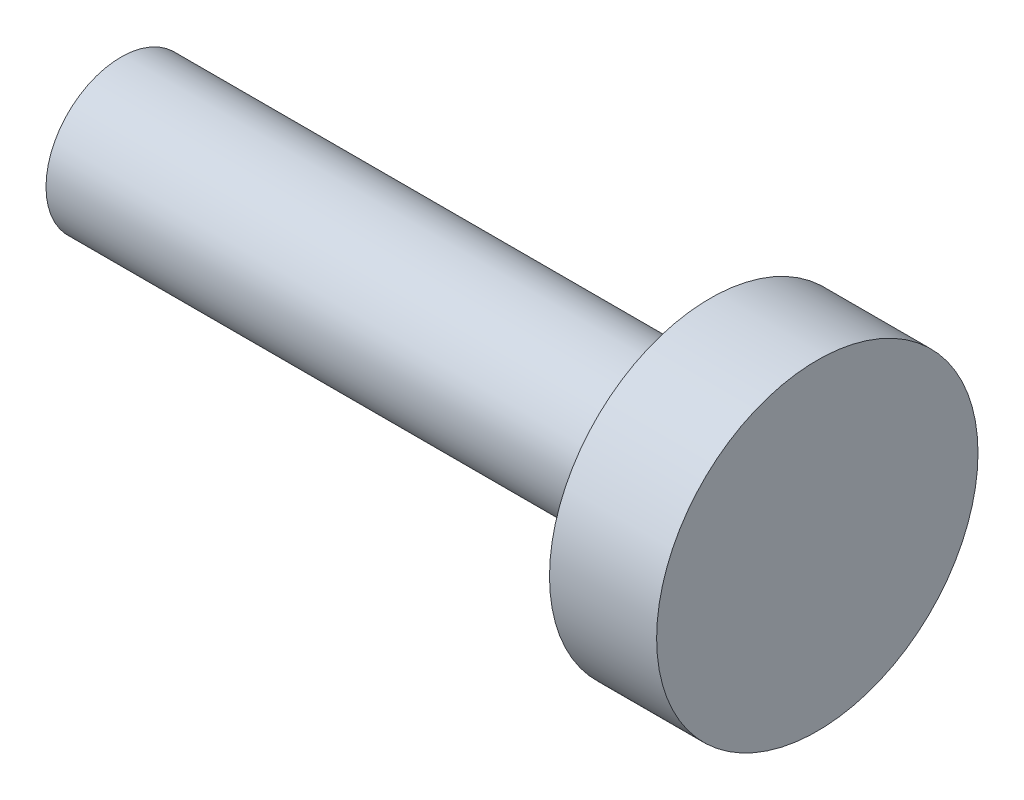
ISO-10303-21;
HEADER;
FILE_DESCRIPTION(('STEP AP214'),'2;1');
FILE_NAME('part.step','',(''),(''),'','','');
FILE_SCHEMA(('AUTOMOTIVE_DESIGN { 1 0 10303 214 1 1 1 1 }'));
ENDSEC;
DATA;
#1=APPLICATION_CONTEXT('core data for automotive mechanical design processes');
#2=APPLICATION_PROTOCOL_DEFINITION('international standard','automotive_design',2000,#1);
#3=PRODUCT_CONTEXT('',#1,'mechanical');
#4=PRODUCT('Part','Part','',(#3));
#5=PRODUCT_RELATED_PRODUCT_CATEGORY('part','',(#4));
#6=PRODUCT_DEFINITION_FORMATION('','',#4);
#7=PRODUCT_DEFINITION_CONTEXT('part definition',#1,'design');
#8=PRODUCT_DEFINITION('design','',#6,#7);
#9=PRODUCT_DEFINITION_SHAPE('','',#8);
#10=(LENGTH_UNIT() NAMED_UNIT(*) SI_UNIT(.MILLI.,.METRE.));
#11=(NAMED_UNIT(*) PLANE_ANGLE_UNIT() SI_UNIT($,.RADIAN.));
#12=(NAMED_UNIT(*) SI_UNIT($,.STERADIAN.) SOLID_ANGLE_UNIT());
#13=UNCERTAINTY_MEASURE_WITH_UNIT(LENGTH_MEASURE(1.E-05),#10,'distance_accuracy_value','');
#14=(GEOMETRIC_REPRESENTATION_CONTEXT(3) GLOBAL_UNCERTAINTY_ASSIGNED_CONTEXT((#13)) GLOBAL_UNIT_ASSIGNED_CONTEXT((#10,
#11,#12)) REPRESENTATION_CONTEXT('',''));
#15=CARTESIAN_POINT('',(0.,0.,0.));
#16=DIRECTION('',(0.,0.,1.));
#17=DIRECTION('',(1.,0.,0.));
#18=AXIS2_PLACEMENT_3D('',#15,#16,#17);
#19=CARTESIAN_POINT('',(16.4491525423729,0.,0.));
#20=DIRECTION('',(-1.,0.,0.));
#21=DIRECTION('',(0.,0.,1.));
#22=AXIS2_PLACEMENT_3D('',#19,#20,#21);
#23=PLANE('',#22);
#24=CARTESIAN_POINT('',(16.4491525423729,0.,0.));
#25=DIRECTION('',(-1.,0.,0.));
#26=DIRECTION('',(0.,0.,1.));
#27=AXIS2_PLACEMENT_3D('',#24,#25,#26);
#28=CIRCLE('',#27,3.);
#29=CARTESIAN_POINT('',(16.4491525423729,0.,3.));
#30=VERTEX_POINT('',#29);
#31=EDGE_CURVE('E10',#30,#30,#28,.T.);
#32=ORIENTED_EDGE('',*,*,#31,.F.);
#33=EDGE_LOOP('',(#32));
#34=FACE_BOUND('',#33,.T.);
#35=ADVANCED_FACE('F41',(#34),#23,.F.);
#36=CARTESIAN_POINT('',(0.,0.,0.));
#37=DIRECTION('',(-1.,0.,0.));
#38=DIRECTION('',(0.,0.,1.));
#39=AXIS2_PLACEMENT_3D('',#36,#37,#38);
#40=CYLINDRICAL_SURFACE('',#39,3.);
#41=ORIENTED_EDGE('',*,*,#31,.T.);
#42=EDGE_LOOP('',(#41));
#43=FACE_BOUND('',#42,.T.);
#44=CARTESIAN_POINT('',(14.4491525423729,0.,0.));
#45=DIRECTION('',(-1.,0.,0.));
#46=DIRECTION('',(0.,0.,1.));
#47=AXIS2_PLACEMENT_3D('',#44,#45,#46);
#48=CIRCLE('',#47,3.);
#49=CARTESIAN_POINT('',(14.4491525423729,0.,3.));
#50=VERTEX_POINT('',#49);
#51=EDGE_CURVE('E48',#50,#50,#48,.T.);
#52=ORIENTED_EDGE('',*,*,#51,.F.);
#53=EDGE_LOOP('',(#52));
#54=FACE_BOUND('',#53,.T.);
#55=ADVANCED_FACE('F77',(#43,#54),#40,.T.);
#56=CARTESIAN_POINT('',(14.4491525423729,0.,0.));
#57=DIRECTION('',(-1.,0.,0.));
#58=DIRECTION('',(0.,0.,1.));
#59=AXIS2_PLACEMENT_3D('',#56,#57,#58);
#60=PLANE('',#59);
#61=ORIENTED_EDGE('',*,*,#51,.T.);
#62=EDGE_LOOP('',(#61));
#63=FACE_BOUND('',#62,.T.);
#64=CARTESIAN_POINT('',(14.4491525423729,0.,0.));
#65=DIRECTION('',(-1.,0.,0.));
#66=DIRECTION('',(0.,0.,1.));
#67=AXIS2_PLACEMENT_3D('',#64,#65,#66);
#68=CIRCLE('',#67,1.4);
#69=CARTESIAN_POINT('',(14.4491525423729,0.,1.4));
#70=VERTEX_POINT('',#69);
#71=EDGE_CURVE('E53',#70,#70,#68,.T.);
#72=ORIENTED_EDGE('',*,*,#71,.F.);
#73=EDGE_LOOP('',(#72));
#74=FACE_BOUND('',#73,.T.);
#75=ADVANCED_FACE('F69',(#63,#74),#60,.T.);
#76=CARTESIAN_POINT('',(0.,0.,0.));
#77=DIRECTION('',(-1.,0.,0.));
#78=DIRECTION('',(0.,0.,1.));
#79=AXIS2_PLACEMENT_3D('',#76,#77,#78);
#80=CYLINDRICAL_SURFACE('',#79,1.4);
#81=ORIENTED_EDGE('',*,*,#71,.T.);
#82=EDGE_LOOP('',(#81));
#83=FACE_BOUND('',#82,.T.);
#84=CARTESIAN_POINT('',(3.44915254237288,0.,0.));
#85=DIRECTION('',(-1.,0.,0.));
#86=DIRECTION('',(0.,0.,1.));
#87=AXIS2_PLACEMENT_3D('',#84,#85,#86);
#88=CIRCLE('',#87,1.4);
#89=CARTESIAN_POINT('',(3.44915254237288,0.,1.4));
#90=VERTEX_POINT('',#89);
#91=EDGE_CURVE('E58',#90,#90,#88,.T.);
#92=ORIENTED_EDGE('',*,*,#91,.F.);
#93=EDGE_LOOP('',(#92));
#94=FACE_BOUND('',#93,.T.);
#95=ADVANCED_FACE('F67',(#83,#94),#80,.T.);
#96=CARTESIAN_POINT('',(3.44915254237288,0.,0.));
#97=DIRECTION('',(-1.,0.,0.));
#98=DIRECTION('',(0.,0.,1.));
#99=AXIS2_PLACEMENT_3D('',#96,#97,#98);
#100=PLANE('',#99);
#101=ORIENTED_EDGE('',*,*,#91,.T.);
#102=EDGE_LOOP('',(#101));
#103=FACE_BOUND('',#102,.T.);
#104=ADVANCED_FACE('F65',(#103),#100,.T.);
#105=CLOSED_SHELL('',(#35,#55,#75,#95,#104));
#106=MANIFOLD_SOLID_BREP('B2',#105);
#107=ADVANCED_BREP_SHAPE_REPRESENTATION('',(#18,#106),#14);
#108=SHAPE_DEFINITION_REPRESENTATION(#9,#107);
ENDSEC;
END-ISO-10303-21;
